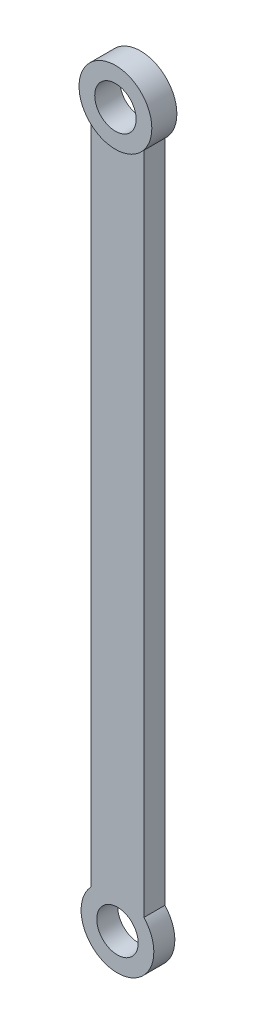
ISO-10303-21;
HEADER;
FILE_DESCRIPTION(('STEP AP214'),'2;1');
FILE_NAME('part.step','',(''),(''),'','','');
FILE_SCHEMA(('AUTOMOTIVE_DESIGN { 1 0 10303 214 1 1 1 1 }'));
ENDSEC;
DATA;
#1=APPLICATION_CONTEXT('core data for automotive mechanical design processes');
#2=APPLICATION_PROTOCOL_DEFINITION('international standard','automotive_design',2000,#1);
#3=PRODUCT_CONTEXT('',#1,'mechanical');
#4=PRODUCT('Part','Part','',(#3));
#5=PRODUCT_RELATED_PRODUCT_CATEGORY('part','',(#4));
#6=PRODUCT_DEFINITION_FORMATION('','',#4);
#7=PRODUCT_DEFINITION_CONTEXT('part definition',#1,'design');
#8=PRODUCT_DEFINITION('design','',#6,#7);
#9=PRODUCT_DEFINITION_SHAPE('','',#8);
#10=(LENGTH_UNIT() NAMED_UNIT(*) SI_UNIT(.MILLI.,.METRE.));
#11=(NAMED_UNIT(*) PLANE_ANGLE_UNIT() SI_UNIT($,.RADIAN.));
#12=(NAMED_UNIT(*) SI_UNIT($,.STERADIAN.) SOLID_ANGLE_UNIT());
#13=UNCERTAINTY_MEASURE_WITH_UNIT(LENGTH_MEASURE(1.E-05),#10,'distance_accuracy_value','');
#14=(GEOMETRIC_REPRESENTATION_CONTEXT(3) GLOBAL_UNCERTAINTY_ASSIGNED_CONTEXT((#13)) GLOBAL_UNIT_ASSIGNED_CONTEXT((#10,
#11,#12)) REPRESENTATION_CONTEXT('',''));
#15=CARTESIAN_POINT('',(0.,0.,0.));
#16=DIRECTION('',(0.,0.,1.));
#17=DIRECTION('',(1.,0.,0.));
#18=AXIS2_PLACEMENT_3D('',#15,#16,#17);
#19=CARTESIAN_POINT('',(-6.54,0.,2.6));
#20=DIRECTION('',(1.,0.,0.));
#21=DIRECTION('',(0.,1.,0.));
#22=AXIS2_PLACEMENT_3D('',#19,#20,#21);
#23=PLANE('',#22);
#24=DIRECTION('',(0.,-1.,0.));
#25=VECTOR('',#24,1.);
#26=CARTESIAN_POINT('',(-6.54,0.,-2.6));
#27=LINE('',#26,#25);
#28=CARTESIAN_POINT('',(-6.54,-6.18291193532627,-2.6));
#29=VERTEX_POINT('',#28);
#30=CARTESIAN_POINT('',(-6.54000000000002,-170.567088064674,-2.6));
#31=VERTEX_POINT('',#30);
#32=EDGE_CURVE('E135',#29,#31,#27,.T.);
#33=ORIENTED_EDGE('',*,*,#32,.T.);
#34=DIRECTION('',(0.,0.,-1.));
#35=VECTOR('',#34,1.);
#36=CARTESIAN_POINT('',(-6.54000000000002,-170.567088064674,2.6));
#37=LINE('',#36,#35);
#38=CARTESIAN_POINT('',(-6.54000000000002,-170.567088064674,2.6));
#39=VERTEX_POINT('',#38);
#40=EDGE_CURVE('E78',#39,#31,#37,.T.);
#41=ORIENTED_EDGE('',*,*,#40,.F.);
#42=DIRECTION('',(0.,-1.,0.));
#43=VECTOR('',#42,1.);
#44=CARTESIAN_POINT('',(-6.54,0.,2.6));
#45=LINE('',#44,#43);
#46=CARTESIAN_POINT('',(-6.54,-6.18291193532627,2.6));
#47=VERTEX_POINT('',#46);
#48=EDGE_CURVE('E112',#47,#39,#45,.T.);
#49=ORIENTED_EDGE('',*,*,#48,.F.);
#50=DIRECTION('',(0.,0.,-1.));
#51=VECTOR('',#50,1.);
#52=CARTESIAN_POINT('',(-6.54,-6.18291193532627,2.6));
#53=LINE('',#52,#51);
#54=EDGE_CURVE('E12',#47,#29,#53,.T.);
#55=ORIENTED_EDGE('',*,*,#54,.T.);
#56=EDGE_LOOP('',(#33,#41,#49,#55));
#57=FACE_BOUND('',#56,.T.);
#58=ADVANCED_FACE('F68',(#57),#23,.F.);
#59=CARTESIAN_POINT('',(6.54,0.,2.6));
#60=DIRECTION('',(1.,0.,0.));
#61=DIRECTION('',(0.,1.,0.));
#62=AXIS2_PLACEMENT_3D('',#59,#60,#61);
#63=PLANE('',#62);
#64=DIRECTION('',(0.,-1.,0.));
#65=VECTOR('',#64,1.);
#66=CARTESIAN_POINT('',(6.54,0.,-2.6));
#67=LINE('',#66,#65);
#68=CARTESIAN_POINT('',(6.54,-6.18291193532627,-2.6));
#69=VERTEX_POINT('',#68);
#70=CARTESIAN_POINT('',(6.54000000000002,-170.567088064674,-2.6));
#71=VERTEX_POINT('',#70);
#72=EDGE_CURVE('E129',#69,#71,#67,.T.);
#73=ORIENTED_EDGE('',*,*,#72,.F.);
#74=DIRECTION('',(0.,0.,-1.));
#75=VECTOR('',#74,1.);
#76=CARTESIAN_POINT('',(6.54,-6.18291193532627,2.6));
#77=LINE('',#76,#75);
#78=CARTESIAN_POINT('',(6.54,-6.18291193532627,2.6));
#79=VERTEX_POINT('',#78);
#80=EDGE_CURVE('E125',#79,#69,#77,.T.);
#81=ORIENTED_EDGE('',*,*,#80,.F.);
#82=DIRECTION('',(0.,-1.,0.));
#83=VECTOR('',#82,1.);
#84=CARTESIAN_POINT('',(6.54,0.,2.6));
#85=LINE('',#84,#83);
#86=CARTESIAN_POINT('',(6.54000000000002,-170.567088064674,2.6));
#87=VERTEX_POINT('',#86);
#88=EDGE_CURVE('E117',#79,#87,#85,.T.);
#89=ORIENTED_EDGE('',*,*,#88,.T.);
#90=DIRECTION('',(0.,0.,-1.));
#91=VECTOR('',#90,1.);
#92=CARTESIAN_POINT('',(6.54000000000002,-170.567088064674,2.6));
#93=LINE('',#92,#91);
#94=EDGE_CURVE('E87',#87,#71,#93,.T.);
#95=ORIENTED_EDGE('',*,*,#94,.T.);
#96=EDGE_LOOP('',(#73,#81,#89,#95));
#97=FACE_BOUND('',#96,.T.);
#98=ADVANCED_FACE('F128',(#97),#63,.T.);
#99=CARTESIAN_POINT('',(0.,0.,-2.6));
#100=DIRECTION('',(0.,0.,1.));
#101=DIRECTION('',(1.,0.,0.));
#102=AXIS2_PLACEMENT_3D('',#99,#100,#101);
#103=PLANE('',#102);
#104=CARTESIAN_POINT('',(0.,0.,-2.6));
#105=DIRECTION('',(0.,0.,1.));
#106=DIRECTION('',(1.,0.,0.));
#107=AXIS2_PLACEMENT_3D('',#104,#105,#106);
#108=CIRCLE('',#107,9.);
#109=EDGE_CURVE('E108',#29,#69,#108,.T.);
#110=ORIENTED_EDGE('',*,*,#109,.T.);
#111=ORIENTED_EDGE('',*,*,#72,.T.);
#112=CARTESIAN_POINT('',(0.,-176.75,-2.6));
#113=DIRECTION('',(0.,0.,1.));
#114=DIRECTION('',(1.,0.,0.));
#115=AXIS2_PLACEMENT_3D('',#112,#113,#114);
#116=CIRCLE('',#115,9.);
#117=EDGE_CURVE('E72',#31,#71,#116,.T.);
#118=ORIENTED_EDGE('',*,*,#117,.F.);
#119=ORIENTED_EDGE('',*,*,#32,.F.);
#120=EDGE_LOOP('',(#110,#111,#118,#119));
#121=FACE_BOUND('',#120,.T.);
#122=CARTESIAN_POINT('',(0.,-176.75,-2.6));
#123=DIRECTION('',(0.,0.,1.));
#124=DIRECTION('',(1.,0.,0.));
#125=AXIS2_PLACEMENT_3D('',#122,#123,#124);
#126=CIRCLE('',#125,5.125);
#127=CARTESIAN_POINT('',(5.125,-176.75,-2.6));
#128=VERTEX_POINT('',#127);
#129=EDGE_CURVE('E149',#128,#128,#126,.T.);
#130=ORIENTED_EDGE('',*,*,#129,.T.);
#131=EDGE_LOOP('',(#130));
#132=FACE_BOUND('',#131,.T.);
#133=ADVANCED_FACE('F153',(#121,#132),#103,.F.);
#134=CARTESIAN_POINT('',(0.,0.,2.6));
#135=DIRECTION('',(0.,0.,1.));
#136=DIRECTION('',(1.,0.,0.));
#137=AXIS2_PLACEMENT_3D('',#134,#135,#136);
#138=PLANE('',#137);
#139=CARTESIAN_POINT('',(0.,0.,2.6));
#140=DIRECTION('',(0.,0.,1.));
#141=DIRECTION('',(1.,0.,0.));
#142=AXIS2_PLACEMENT_3D('',#139,#140,#141);
#143=CIRCLE('',#142,9.);
#144=EDGE_CURVE('E122',#47,#79,#143,.T.);
#145=ORIENTED_EDGE('',*,*,#144,.F.);
#146=ORIENTED_EDGE('',*,*,#48,.T.);
#147=CARTESIAN_POINT('',(0.,-176.75,2.6));
#148=DIRECTION('',(0.,0.,1.));
#149=DIRECTION('',(1.,0.,0.));
#150=AXIS2_PLACEMENT_3D('',#147,#148,#149);
#151=CIRCLE('',#150,9.);
#152=EDGE_CURVE('E124',#39,#87,#151,.T.);
#153=ORIENTED_EDGE('',*,*,#152,.T.);
#154=ORIENTED_EDGE('',*,*,#88,.F.);
#155=EDGE_LOOP('',(#145,#146,#153,#154));
#156=FACE_BOUND('',#155,.T.);
#157=CARTESIAN_POINT('',(0.,-176.75,2.6));
#158=DIRECTION('',(0.,0.,1.));
#159=DIRECTION('',(1.,0.,0.));
#160=AXIS2_PLACEMENT_3D('',#157,#158,#159);
#161=CIRCLE('',#160,5.125);
#162=CARTESIAN_POINT('',(5.125,-176.75,2.6));
#163=VERTEX_POINT('',#162);
#164=EDGE_CURVE('E146',#163,#163,#161,.T.);
#165=ORIENTED_EDGE('',*,*,#164,.F.);
#166=EDGE_LOOP('',(#165));
#167=FACE_BOUND('',#166,.T.);
#168=ADVANCED_FACE('F119',(#156,#167),#138,.T.);
#169=CARTESIAN_POINT('',(0.,-176.75,2.6));
#170=DIRECTION('',(0.,0.,-1.));
#171=DIRECTION('',(-1.,0.,0.));
#172=AXIS2_PLACEMENT_3D('',#169,#170,#171);
#173=CYLINDRICAL_SURFACE('',#172,5.125);
#174=ORIENTED_EDGE('',*,*,#164,.T.);
#175=EDGE_LOOP('',(#174));
#176=FACE_BOUND('',#175,.T.);
#177=ORIENTED_EDGE('',*,*,#129,.F.);
#178=EDGE_LOOP('',(#177));
#179=FACE_BOUND('',#178,.T.);
#180=ADVANCED_FACE('F159',(#176,#179),#173,.F.);
#181=CARTESIAN_POINT('',(0.,-176.75,2.6));
#182=DIRECTION('',(0.,0.,-1.));
#183=DIRECTION('',(-1.,0.,0.));
#184=AXIS2_PLACEMENT_3D('',#181,#182,#183);
#185=CYLINDRICAL_SURFACE('',#184,9.);
#186=ORIENTED_EDGE('',*,*,#152,.F.);
#187=ORIENTED_EDGE('',*,*,#40,.T.);
#188=ORIENTED_EDGE('',*,*,#117,.T.);
#189=ORIENTED_EDGE('',*,*,#94,.F.);
#190=EDGE_LOOP('',(#186,#187,#188,#189));
#191=FACE_BOUND('',#190,.T.);
#192=ADVANCED_FACE('F70',(#191),#185,.T.);
#193=CARTESIAN_POINT('',(0.,0.,3.1));
#194=DIRECTION('',(0.,0.,-1.));
#195=DIRECTION('',(-1.,0.,0.));
#196=AXIS2_PLACEMENT_3D('',#193,#194,#195);
#197=CYLINDRICAL_SURFACE('',#196,9.);
#198=CARTESIAN_POINT('',(0.,0.,3.1));
#199=DIRECTION('',(0.,0.,1.));
#200=DIRECTION('',(1.,0.,0.));
#201=AXIS2_PLACEMENT_3D('',#198,#199,#200);
#202=CIRCLE('',#201,9.);
#203=CARTESIAN_POINT('',(9.,0.,3.1));
#204=VERTEX_POINT('',#203);
#205=EDGE_CURVE('E193',#204,#204,#202,.T.);
#206=ORIENTED_EDGE('',*,*,#205,.F.);
#207=EDGE_LOOP('',(#206));
#208=FACE_BOUND('',#207,.T.);
#209=CARTESIAN_POINT('',(0.,0.,-3.1));
#210=DIRECTION('',(0.,0.,1.));
#211=DIRECTION('',(1.,0.,0.));
#212=AXIS2_PLACEMENT_3D('',#209,#210,#211);
#213=CIRCLE('',#212,9.);
#214=CARTESIAN_POINT('',(9.,0.,-3.1));
#215=VERTEX_POINT('',#214);
#216=EDGE_CURVE('E198',#215,#215,#213,.T.);
#217=ORIENTED_EDGE('',*,*,#216,.T.);
#218=EDGE_LOOP('',(#217));
#219=FACE_BOUND('',#218,.T.);
#220=ORIENTED_EDGE('',*,*,#80,.T.);
#221=ORIENTED_EDGE('',*,*,#109,.F.);
#222=ORIENTED_EDGE('',*,*,#54,.F.);
#223=ORIENTED_EDGE('',*,*,#144,.T.);
#224=EDGE_LOOP('',(#220,#221,#222,#223));
#225=FACE_BOUND('',#224,.T.);
#226=ADVANCED_FACE('F132',(#208,#219,#225),#197,.T.);
#227=CARTESIAN_POINT('',(0.,0.,3.1));
#228=DIRECTION('',(0.,0.,-1.));
#229=DIRECTION('',(-1.,0.,0.));
#230=AXIS2_PLACEMENT_3D('',#227,#228,#229);
#231=CYLINDRICAL_SURFACE('',#230,5.125);
#232=CARTESIAN_POINT('',(0.,0.,3.1));
#233=DIRECTION('',(0.,0.,1.));
#234=DIRECTION('',(1.,0.,0.));
#235=AXIS2_PLACEMENT_3D('',#232,#233,#234);
#236=CIRCLE('',#235,5.125);
#237=CARTESIAN_POINT('',(-5.125,0.,3.1));
#238=VERTEX_POINT('',#237);
#239=EDGE_CURVE('E151',#238,#238,#236,.T.);
#240=CARTESIAN_POINT('',(0.,0.,-3.1));
#241=DIRECTION('',(0.,0.,1.));
#242=DIRECTION('',(1.,0.,0.));
#243=AXIS2_PLACEMENT_3D('',#240,#241,#242);
#244=CIRCLE('',#243,5.125);
#245=CARTESIAN_POINT('',(-5.125,0.,-3.1));
#246=VERTEX_POINT('',#245);
#247=EDGE_CURVE('E138',#246,#246,#244,.T.);
#248=CARTESIAN_POINT('',(-5.125,0.,3.1));
#249=CARTESIAN_POINT('',(-5.125,0.,3.03541666666667));
#250=CARTESIAN_POINT('',(-5.125,0.,2.97083333333333));
#251=CARTESIAN_POINT('',(-5.125,0.,2.84166666666667));
#252=CARTESIAN_POINT('',(-5.125,0.,2.77708333333333));
#253=CARTESIAN_POINT('',(-5.125,0.,2.64791666666667));
#254=CARTESIAN_POINT('',(-5.125,0.,2.58333333333333));
#255=CARTESIAN_POINT('',(-5.125,0.,2.45416666666667));
#256=CARTESIAN_POINT('',(-5.125,0.,2.38958333333333));
#257=CARTESIAN_POINT('',(-5.125,0.,2.26041666666667));
#258=CARTESIAN_POINT('',(-5.125,0.,2.19583333333333));
#259=CARTESIAN_POINT('',(-5.125,0.,2.06666666666667));
#260=CARTESIAN_POINT('',(-5.125,0.,2.00208333333333));
#261=CARTESIAN_POINT('',(-5.125,0.,1.87291666666667));
#262=CARTESIAN_POINT('',(-5.125,0.,1.80833333333333));
#263=CARTESIAN_POINT('',(-5.125,0.,1.67916666666667));
#264=CARTESIAN_POINT('',(-5.125,0.,1.61458333333333));
#265=CARTESIAN_POINT('',(-5.125,0.,1.48541666666667));
#266=CARTESIAN_POINT('',(-5.125,0.,1.42083333333333));
#267=CARTESIAN_POINT('',(-5.125,0.,1.29166666666667));
#268=CARTESIAN_POINT('',(-5.125,0.,1.22708333333333));
#269=CARTESIAN_POINT('',(-5.125,0.,1.09791666666667));
#270=CARTESIAN_POINT('',(-5.125,0.,1.03333333333333));
#271=CARTESIAN_POINT('',(-5.125,0.,0.904166666666666));
#272=CARTESIAN_POINT('',(-5.125,0.,0.839583333333333));
#273=CARTESIAN_POINT('',(-5.125,0.,0.710416666666666));
#274=CARTESIAN_POINT('',(-5.125,0.,0.645833333333333));
#275=CARTESIAN_POINT('',(-5.125,0.,0.516666666666666));
#276=CARTESIAN_POINT('',(-5.125,0.,0.452083333333333));
#277=CARTESIAN_POINT('',(-5.125,0.,0.322916666666666));
#278=CARTESIAN_POINT('',(-5.125,0.,0.258333333333333));
#279=CARTESIAN_POINT('',(-5.125,0.,0.129166666666666));
#280=CARTESIAN_POINT('',(-5.125,0.,0.0645833333333329));
#281=CARTESIAN_POINT('',(-5.125,0.,-0.0645833333333337));
#282=CARTESIAN_POINT('',(-5.125,0.,-0.129166666666667));
#283=CARTESIAN_POINT('',(-5.125,0.,-0.258333333333334));
#284=CARTESIAN_POINT('',(-5.125,0.,-0.322916666666667));
#285=CARTESIAN_POINT('',(-5.125,0.,-0.452083333333334));
#286=CARTESIAN_POINT('',(-5.125,0.,-0.516666666666667));
#287=CARTESIAN_POINT('',(-5.125,0.,-0.645833333333334));
#288=CARTESIAN_POINT('',(-5.125,0.,-0.710416666666667));
#289=CARTESIAN_POINT('',(-5.125,0.,-0.839583333333333));
#290=CARTESIAN_POINT('',(-5.125,0.,-0.904166666666667));
#291=CARTESIAN_POINT('',(-5.125,0.,-1.03333333333333));
#292=CARTESIAN_POINT('',(-5.125,0.,-1.09791666666667));
#293=CARTESIAN_POINT('',(-5.125,0.,-1.22708333333333));
#294=CARTESIAN_POINT('',(-5.125,0.,-1.29166666666667));
#295=CARTESIAN_POINT('',(-5.125,0.,-1.42083333333333));
#296=CARTESIAN_POINT('',(-5.125,0.,-1.48541666666667));
#297=CARTESIAN_POINT('',(-5.125,0.,-1.61458333333333));
#298=CARTESIAN_POINT('',(-5.125,0.,-1.67916666666667));
#299=CARTESIAN_POINT('',(-5.125,0.,-1.80833333333333));
#300=CARTESIAN_POINT('',(-5.125,0.,-1.87291666666667));
#301=CARTESIAN_POINT('',(-5.125,0.,-2.00208333333333));
#302=CARTESIAN_POINT('',(-5.125,0.,-2.06666666666667));
#303=CARTESIAN_POINT('',(-5.125,0.,-2.19583333333333));
#304=CARTESIAN_POINT('',(-5.125,0.,-2.26041666666667));
#305=CARTESIAN_POINT('',(-5.125,0.,-2.38958333333333));
#306=CARTESIAN_POINT('',(-5.125,0.,-2.45416666666667));
#307=CARTESIAN_POINT('',(-5.125,0.,-2.58333333333333));
#308=CARTESIAN_POINT('',(-5.125,0.,-2.64791666666667));
#309=CARTESIAN_POINT('',(-5.125,0.,-2.77708333333333));
#310=CARTESIAN_POINT('',(-5.125,0.,-2.84166666666667));
#311=CARTESIAN_POINT('',(-5.125,0.,-2.97083333333333));
#312=CARTESIAN_POINT('',(-5.125,0.,-3.03541666666667));
#313=CARTESIAN_POINT('',(-5.125,0.,-3.1));
#314=B_SPLINE_CURVE_WITH_KNOTS('',3,(#248,#249,#250,#251,#252,#253,#254,#255,#256,#257,#258,
#259,#260,#261,#262,#263,#264,#265,#266,#267,#268,#269,#270,#271,#272,#273,#274,#275,#276,#277,
#278,#279,#280,#281,#282,#283,#284,#285,#286,#287,#288,#289,#290,#291,#292,#293,#294,#295,#296,
#297,#298,#299,#300,#301,#302,#303,#304,#305,#306,#307,#308,#309,#310,#311,#312,#313),
.UNSPECIFIED.,.F.,.F.,(4,2,2,2,2,2,2,2,2,2,2,2,2,2,2,2,2,2,2,2,2,2,2,2,2,2,2,2,2,2,2,2,4),(0.,
0.19375,0.3875,0.58125,0.775,0.96875,1.1625,1.35625,1.55,1.74375,1.9375,2.13125,2.325,2.51875,
2.7125,2.90625,3.1,3.29375,3.4875,3.68125,3.875,4.06875,4.2625,4.45625,4.65,4.84375,5.0375,
5.23125,5.425,5.61875,5.8125,6.00625,6.2),.UNSPECIFIED.);
#315=EDGE_CURVE('BSEAM169',#238,#246,#314,.T.);
#316=ORIENTED_EDGE('',*,*,#239,.T.);
#317=ORIENTED_EDGE('',*,*,#247,.F.);
#318=ORIENTED_EDGE('',*,*,#315,.T.);
#319=ORIENTED_EDGE('',*,*,#315,.F.);
#320=EDGE_LOOP('',(#316,#318,#317,#319));
#321=FACE_BOUND('',#320,.T.);
#322=ADVANCED_FACE('F169',(#321),#231,.F.);
#323=CARTESIAN_POINT('',(0.,0.,3.1));
#324=DIRECTION('',(0.,0.,1.));
#325=DIRECTION('',(1.,0.,0.));
#326=AXIS2_PLACEMENT_3D('',#323,#324,#325);
#327=PLANE('',#326);
#328=ORIENTED_EDGE('',*,*,#205,.T.);
#329=EDGE_LOOP('',(#328));
#330=FACE_BOUND('',#329,.T.);
#331=ORIENTED_EDGE('',*,*,#239,.F.);
#332=EDGE_LOOP('',(#331));
#333=FACE_BOUND('',#332,.T.);
#334=ADVANCED_FACE('F180',(#330,#333),#327,.T.);
#335=CARTESIAN_POINT('',(0.,0.,-3.1));
#336=DIRECTION('',(0.,0.,1.));
#337=DIRECTION('',(1.,0.,0.));
#338=AXIS2_PLACEMENT_3D('',#335,#336,#337);
#339=PLANE('',#338);
#340=ORIENTED_EDGE('',*,*,#216,.F.);
#341=EDGE_LOOP('',(#340));
#342=FACE_BOUND('',#341,.T.);
#343=ORIENTED_EDGE('',*,*,#247,.T.);
#344=EDGE_LOOP('',(#343));
#345=FACE_BOUND('',#344,.T.);
#346=ADVANCED_FACE('F182',(#342,#345),#339,.F.);
#347=CLOSED_SHELL('',(#58,#98,#133,#168,#180,#192,#226,#322,#334,#346));
#348=MANIFOLD_SOLID_BREP('B2',#347);
#349=ADVANCED_BREP_SHAPE_REPRESENTATION('',(#18,#348),#14);
#350=SHAPE_DEFINITION_REPRESENTATION(#9,#349);
ENDSEC;
END-ISO-10303-21;
